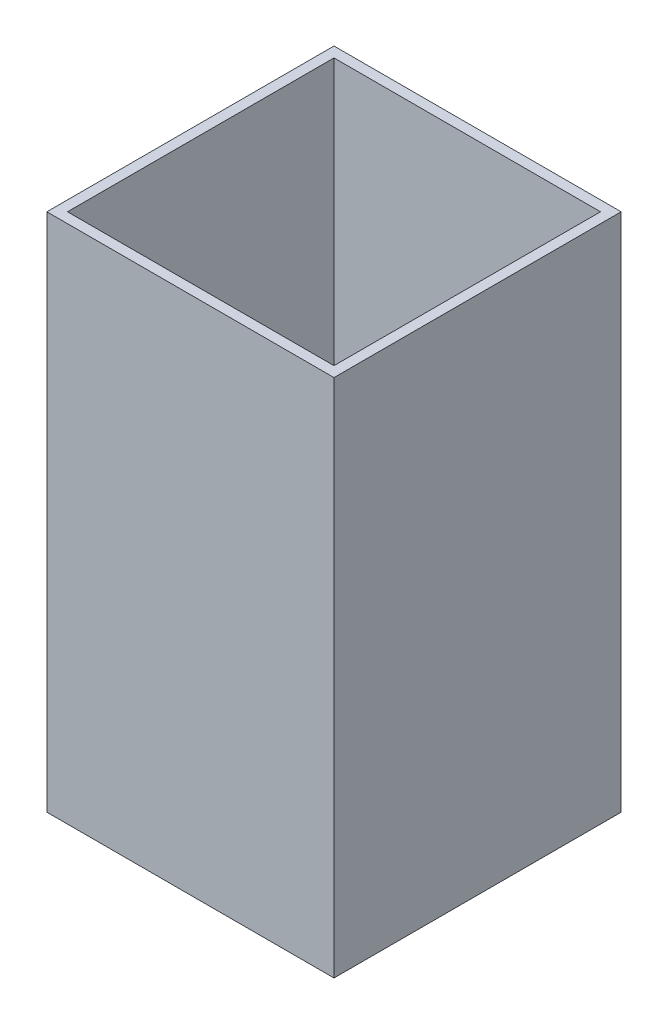
ISO-10303-21;
HEADER;
FILE_DESCRIPTION(('STEP AP214'),'2;1');
FILE_NAME('part.step','',(''),(''),'','','');
FILE_SCHEMA(('AUTOMOTIVE_DESIGN { 1 0 10303 214 1 1 1 1 }'));
ENDSEC;
DATA;
#1=APPLICATION_CONTEXT('core data for automotive mechanical design processes');
#2=APPLICATION_PROTOCOL_DEFINITION('international standard','automotive_design',2000,#1);
#3=PRODUCT_CONTEXT('',#1,'mechanical');
#4=PRODUCT('Part','Part','',(#3));
#5=PRODUCT_RELATED_PRODUCT_CATEGORY('part','',(#4));
#6=PRODUCT_DEFINITION_FORMATION('','',#4);
#7=PRODUCT_DEFINITION_CONTEXT('part definition',#1,'design');
#8=PRODUCT_DEFINITION('design','',#6,#7);
#9=PRODUCT_DEFINITION_SHAPE('','',#8);
#10=(LENGTH_UNIT() NAMED_UNIT(*) SI_UNIT(.MILLI.,.METRE.));
#11=(NAMED_UNIT(*) PLANE_ANGLE_UNIT() SI_UNIT($,.RADIAN.));
#12=(NAMED_UNIT(*) SI_UNIT($,.STERADIAN.) SOLID_ANGLE_UNIT());
#13=UNCERTAINTY_MEASURE_WITH_UNIT(LENGTH_MEASURE(1.E-05),#10,'distance_accuracy_value','');
#14=(GEOMETRIC_REPRESENTATION_CONTEXT(3) GLOBAL_UNCERTAINTY_ASSIGNED_CONTEXT((#13)) GLOBAL_UNIT_ASSIGNED_CONTEXT((#10,
#11,#12)) REPRESENTATION_CONTEXT('',''));
#15=CARTESIAN_POINT('',(0.,0.,0.));
#16=DIRECTION('',(0.,0.,1.));
#17=DIRECTION('',(1.,0.,0.));
#18=AXIS2_PLACEMENT_3D('',#15,#16,#17);
#19=CARTESIAN_POINT('',(3.175,160.,-3.17499999999999));
#20=DIRECTION('',(1.,0.,0.));
#21=DIRECTION('',(0.,0.,-1.));
#22=AXIS2_PLACEMENT_3D('',#19,#20,#21);
#23=PLANE('',#22);
#24=DIRECTION('',(0.,-1.,0.));
#25=VECTOR('',#24,1.);
#26=CARTESIAN_POINT('',(3.175,160.,-3.17499999999999));
#27=LINE('',#26,#25);
#28=CARTESIAN_POINT('',(3.175,160.,-3.17499999999999));
#29=VERTEX_POINT('',#28);
#30=CARTESIAN_POINT('',(3.175,3.17500000000001,-3.17499999999999));
#31=VERTEX_POINT('',#30);
#32=EDGE_CURVE('E105',#29,#31,#27,.T.);
#33=ORIENTED_EDGE('',*,*,#32,.T.);
#34=DIRECTION('',(0.,0.,-1.));
#35=VECTOR('',#34,1.);
#36=CARTESIAN_POINT('',(3.175,3.17500000000001,-3.17499999999999));
#37=LINE('',#36,#35);
#38=CARTESIAN_POINT('',(3.17499999999998,3.17500000000001,-85.175));
#39=VERTEX_POINT('',#38);
#40=EDGE_CURVE('E96',#31,#39,#37,.T.);
#41=ORIENTED_EDGE('',*,*,#40,.T.);
#42=DIRECTION('',(0.,-1.,0.));
#43=VECTOR('',#42,1.);
#44=CARTESIAN_POINT('',(3.17499999999998,160.,-85.175));
#45=LINE('',#44,#43);
#46=CARTESIAN_POINT('',(3.17499999999998,160.,-85.175));
#47=VERTEX_POINT('',#46);
#48=EDGE_CURVE('E102',#47,#39,#45,.T.);
#49=ORIENTED_EDGE('',*,*,#48,.F.);
#50=DIRECTION('',(0.,0.,1.));
#51=VECTOR('',#50,1.);
#52=CARTESIAN_POINT('',(3.175,160.,-3.17499999999999));
#53=LINE('',#52,#51);
#54=EDGE_CURVE('E106',#47,#29,#53,.T.);
#55=ORIENTED_EDGE('',*,*,#54,.T.);
#56=EDGE_LOOP('',(#33,#41,#49,#55));
#57=FACE_BOUND('',#56,.T.);
#58=ADVANCED_FACE('F33',(#57),#23,.T.);
#59=CARTESIAN_POINT('',(3.175,160.,-3.17499999999999));
#60=DIRECTION('',(0.,0.,-1.));
#61=DIRECTION('',(-1.,0.,0.));
#62=AXIS2_PLACEMENT_3D('',#59,#60,#61);
#63=PLANE('',#62);
#64=DIRECTION('',(0.,-1.,0.));
#65=VECTOR('',#64,1.);
#66=CARTESIAN_POINT('',(85.175,160.,-3.17499999999999));
#67=LINE('',#66,#65);
#68=CARTESIAN_POINT('',(85.175,160.,-3.17499999999999));
#69=VERTEX_POINT('',#68);
#70=CARTESIAN_POINT('',(85.175,3.17500000000001,-3.17499999999999));
#71=VERTEX_POINT('',#70);
#72=EDGE_CURVE('E113',#69,#71,#67,.T.);
#73=ORIENTED_EDGE('',*,*,#72,.T.);
#74=DIRECTION('',(-1.,0.,0.));
#75=VECTOR('',#74,1.);
#76=CARTESIAN_POINT('',(3.175,3.17500000000001,-3.17499999999999));
#77=LINE('',#76,#75);
#78=EDGE_CURVE('E107',#71,#31,#77,.T.);
#79=ORIENTED_EDGE('',*,*,#78,.T.);
#80=ORIENTED_EDGE('',*,*,#32,.F.);
#81=DIRECTION('',(1.,0.,0.));
#82=VECTOR('',#81,1.);
#83=CARTESIAN_POINT('',(3.175,160.,-3.17499999999999));
#84=LINE('',#83,#82);
#85=EDGE_CURVE('E175',#29,#69,#84,.T.);
#86=ORIENTED_EDGE('',*,*,#85,.T.);
#87=EDGE_LOOP('',(#73,#79,#80,#86));
#88=FACE_BOUND('',#87,.T.);
#89=ADVANCED_FACE('F183',(#88),#63,.T.);
#90=CARTESIAN_POINT('',(85.175,160.,-3.17499999999999));
#91=DIRECTION('',(-1.,0.,0.));
#92=DIRECTION('',(0.,0.,1.));
#93=AXIS2_PLACEMENT_3D('',#90,#91,#92);
#94=PLANE('',#93);
#95=DIRECTION('',(0.,-1.,0.));
#96=VECTOR('',#95,1.);
#97=CARTESIAN_POINT('',(85.175,160.,-85.175));
#98=LINE('',#97,#96);
#99=CARTESIAN_POINT('',(85.175,160.,-85.175));
#100=VERTEX_POINT('',#99);
#101=CARTESIAN_POINT('',(85.175,3.17500000000001,-85.175));
#102=VERTEX_POINT('',#101);
#103=EDGE_CURVE('E54',#100,#102,#98,.T.);
#104=ORIENTED_EDGE('',*,*,#103,.T.);
#105=DIRECTION('',(0.,0.,1.));
#106=VECTOR('',#105,1.);
#107=CARTESIAN_POINT('',(85.175,3.17500000000001,-3.17499999999999));
#108=LINE('',#107,#106);
#109=EDGE_CURVE('E48',#102,#71,#108,.T.);
#110=ORIENTED_EDGE('',*,*,#109,.T.);
#111=ORIENTED_EDGE('',*,*,#72,.F.);
#112=DIRECTION('',(0.,0.,-1.));
#113=VECTOR('',#112,1.);
#114=CARTESIAN_POINT('',(85.175,160.,-3.17499999999999));
#115=LINE('',#114,#113);
#116=EDGE_CURVE('E115',#69,#100,#115,.T.);
#117=ORIENTED_EDGE('',*,*,#116,.T.);
#118=EDGE_LOOP('',(#104,#110,#111,#117));
#119=FACE_BOUND('',#118,.T.);
#120=ADVANCED_FACE('F181',(#119),#94,.T.);
#121=CARTESIAN_POINT('',(3.17499999999998,160.,-85.175));
#122=DIRECTION('',(0.,0.,1.));
#123=DIRECTION('',(1.,0.,0.));
#124=AXIS2_PLACEMENT_3D('',#121,#122,#123);
#125=PLANE('',#124);
#126=ORIENTED_EDGE('',*,*,#48,.T.);
#127=DIRECTION('',(1.,0.,0.));
#128=VECTOR('',#127,1.);
#129=CARTESIAN_POINT('',(3.17499999999998,3.17500000000001,-85.175));
#130=LINE('',#129,#128);
#131=EDGE_CURVE('E11',#39,#102,#130,.T.);
#132=ORIENTED_EDGE('',*,*,#131,.T.);
#133=ORIENTED_EDGE('',*,*,#103,.F.);
#134=DIRECTION('',(-1.,0.,0.));
#135=VECTOR('',#134,1.);
#136=CARTESIAN_POINT('',(3.17499999999998,160.,-85.175));
#137=LINE('',#136,#135);
#138=EDGE_CURVE('E111',#100,#47,#137,.T.);
#139=ORIENTED_EDGE('',*,*,#138,.T.);
#140=EDGE_LOOP('',(#126,#132,#133,#139));
#141=FACE_BOUND('',#140,.T.);
#142=ADVANCED_FACE('F109',(#141),#125,.T.);
#143=CARTESIAN_POINT('',(0.,160.,0.));
#144=DIRECTION('',(0.,-1.,0.));
#145=DIRECTION('',(0.,0.,-1.));
#146=AXIS2_PLACEMENT_3D('',#143,#144,#145);
#147=PLANE('',#146);
#148=DIRECTION('',(0.,0.,1.));
#149=VECTOR('',#148,1.);
#150=CARTESIAN_POINT('',(0.,160.,0.));
#151=LINE('',#150,#149);
#152=CARTESIAN_POINT('',(0.,160.,-88.35));
#153=VERTEX_POINT('',#152);
#154=CARTESIAN_POINT('',(0.,160.,0.));
#155=VERTEX_POINT('',#154);
#156=EDGE_CURVE('E123',#153,#155,#151,.T.);
#157=ORIENTED_EDGE('',*,*,#156,.T.);
#158=DIRECTION('',(1.,0.,0.));
#159=VECTOR('',#158,1.);
#160=CARTESIAN_POINT('',(0.,160.,0.));
#161=LINE('',#160,#159);
#162=CARTESIAN_POINT('',(88.35,160.,0.));
#163=VERTEX_POINT('',#162);
#164=EDGE_CURVE('E126',#155,#163,#161,.T.);
#165=ORIENTED_EDGE('',*,*,#164,.T.);
#166=DIRECTION('',(0.,0.,-1.));
#167=VECTOR('',#166,1.);
#168=CARTESIAN_POINT('',(88.35,160.,0.));
#169=LINE('',#168,#167);
#170=CARTESIAN_POINT('',(88.35,160.,-88.35));
#171=VERTEX_POINT('',#170);
#172=EDGE_CURVE('E129',#163,#171,#169,.T.);
#173=ORIENTED_EDGE('',*,*,#172,.T.);
#174=DIRECTION('',(-1.,0.,0.));
#175=VECTOR('',#174,1.);
#176=CARTESIAN_POINT('',(0.,160.,-88.35));
#177=LINE('',#176,#175);
#178=EDGE_CURVE('E131',#171,#153,#177,.T.);
#179=ORIENTED_EDGE('',*,*,#178,.T.);
#180=EDGE_LOOP('',(#157,#165,#173,#179));
#181=FACE_BOUND('',#180,.T.);
#182=ORIENTED_EDGE('',*,*,#54,.F.);
#183=ORIENTED_EDGE('',*,*,#138,.F.);
#184=ORIENTED_EDGE('',*,*,#116,.F.);
#185=ORIENTED_EDGE('',*,*,#85,.F.);
#186=EDGE_LOOP('',(#182,#183,#184,#185));
#187=FACE_BOUND('',#186,.T.);
#188=ADVANCED_FACE('F169',(#181,#187),#147,.F.);
#189=CARTESIAN_POINT('',(0.,0.,0.));
#190=DIRECTION('',(0.,-1.,0.));
#191=DIRECTION('',(0.,0.,-1.));
#192=AXIS2_PLACEMENT_3D('',#189,#190,#191);
#193=PLANE('',#192);
#194=DIRECTION('',(0.,0.,1.));
#195=VECTOR('',#194,1.);
#196=CARTESIAN_POINT('',(0.,0.,0.));
#197=LINE('',#196,#195);
#198=CARTESIAN_POINT('',(0.,0.,-88.35));
#199=VERTEX_POINT('',#198);
#200=CARTESIAN_POINT('',(0.,0.,0.));
#201=VERTEX_POINT('',#200);
#202=EDGE_CURVE('E122',#199,#201,#197,.T.);
#203=ORIENTED_EDGE('',*,*,#202,.F.);
#204=DIRECTION('',(-1.,0.,0.));
#205=VECTOR('',#204,1.);
#206=CARTESIAN_POINT('',(0.,0.,-88.35));
#207=LINE('',#206,#205);
#208=CARTESIAN_POINT('',(88.35,0.,-88.35));
#209=VERTEX_POINT('',#208);
#210=EDGE_CURVE('E127',#209,#199,#207,.T.);
#211=ORIENTED_EDGE('',*,*,#210,.F.);
#212=DIRECTION('',(0.,0.,-1.));
#213=VECTOR('',#212,1.);
#214=CARTESIAN_POINT('',(88.35,0.,0.));
#215=LINE('',#214,#213);
#216=CARTESIAN_POINT('',(88.35,0.,0.));
#217=VERTEX_POINT('',#216);
#218=EDGE_CURVE('E139',#217,#209,#215,.T.);
#219=ORIENTED_EDGE('',*,*,#218,.F.);
#220=DIRECTION('',(1.,0.,0.));
#221=VECTOR('',#220,1.);
#222=CARTESIAN_POINT('',(0.,0.,0.));
#223=LINE('',#222,#221);
#224=EDGE_CURVE('E136',#201,#217,#223,.T.);
#225=ORIENTED_EDGE('',*,*,#224,.F.);
#226=EDGE_LOOP('',(#203,#211,#219,#225));
#227=FACE_BOUND('',#226,.T.);
#228=ADVANCED_FACE('F158',(#227),#193,.T.);
#229=CARTESIAN_POINT('',(0.,160.,0.));
#230=DIRECTION('',(1.,0.,0.));
#231=DIRECTION('',(0.,0.,-1.));
#232=AXIS2_PLACEMENT_3D('',#229,#230,#231);
#233=PLANE('',#232);
#234=ORIENTED_EDGE('',*,*,#202,.T.);
#235=DIRECTION('',(0.,-1.,0.));
#236=VECTOR('',#235,1.);
#237=CARTESIAN_POINT('',(0.,160.,0.));
#238=LINE('',#237,#236);
#239=EDGE_CURVE('E41',#155,#201,#238,.T.);
#240=ORIENTED_EDGE('',*,*,#239,.F.);
#241=ORIENTED_EDGE('',*,*,#156,.F.);
#242=DIRECTION('',(0.,-1.,0.));
#243=VECTOR('',#242,1.);
#244=CARTESIAN_POINT('',(0.,160.,-88.35));
#245=LINE('',#244,#243);
#246=EDGE_CURVE('E133',#153,#199,#245,.T.);
#247=ORIENTED_EDGE('',*,*,#246,.T.);
#248=EDGE_LOOP('',(#234,#240,#241,#247));
#249=FACE_BOUND('',#248,.T.);
#250=ADVANCED_FACE('F35',(#249),#233,.F.);
#251=CARTESIAN_POINT('',(0.,160.,0.));
#252=DIRECTION('',(0.,0.,-1.));
#253=DIRECTION('',(-1.,0.,0.));
#254=AXIS2_PLACEMENT_3D('',#251,#252,#253);
#255=PLANE('',#254);
#256=ORIENTED_EDGE('',*,*,#224,.T.);
#257=DIRECTION('',(0.,-1.,0.));
#258=VECTOR('',#257,1.);
#259=CARTESIAN_POINT('',(88.35,160.,0.));
#260=LINE('',#259,#258);
#261=EDGE_CURVE('E147',#163,#217,#260,.T.);
#262=ORIENTED_EDGE('',*,*,#261,.F.);
#263=ORIENTED_EDGE('',*,*,#164,.F.);
#264=ORIENTED_EDGE('',*,*,#239,.T.);
#265=EDGE_LOOP('',(#256,#262,#263,#264));
#266=FACE_BOUND('',#265,.T.);
#267=ADVANCED_FACE('F151',(#266),#255,.F.);
#268=CARTESIAN_POINT('',(88.35,160.,0.));
#269=DIRECTION('',(-1.,0.,0.));
#270=DIRECTION('',(0.,0.,1.));
#271=AXIS2_PLACEMENT_3D('',#268,#269,#270);
#272=PLANE('',#271);
#273=ORIENTED_EDGE('',*,*,#218,.T.);
#274=DIRECTION('',(0.,-1.,0.));
#275=VECTOR('',#274,1.);
#276=CARTESIAN_POINT('',(88.35,160.,-88.35));
#277=LINE('',#276,#275);
#278=EDGE_CURVE('E145',#171,#209,#277,.T.);
#279=ORIENTED_EDGE('',*,*,#278,.F.);
#280=ORIENTED_EDGE('',*,*,#172,.F.);
#281=ORIENTED_EDGE('',*,*,#261,.T.);
#282=EDGE_LOOP('',(#273,#279,#280,#281));
#283=FACE_BOUND('',#282,.T.);
#284=ADVANCED_FACE('F167',(#283),#272,.F.);
#285=CARTESIAN_POINT('',(0.,160.,-88.35));
#286=DIRECTION('',(0.,0.,1.));
#287=DIRECTION('',(1.,0.,0.));
#288=AXIS2_PLACEMENT_3D('',#285,#286,#287);
#289=PLANE('',#288);
#290=ORIENTED_EDGE('',*,*,#210,.T.);
#291=ORIENTED_EDGE('',*,*,#246,.F.);
#292=ORIENTED_EDGE('',*,*,#178,.F.);
#293=ORIENTED_EDGE('',*,*,#278,.T.);
#294=EDGE_LOOP('',(#290,#291,#292,#293));
#295=FACE_BOUND('',#294,.T.);
#296=ADVANCED_FACE('F163',(#295),#289,.F.);
#297=CARTESIAN_POINT('',(0.,3.175,0.));
#298=DIRECTION('',(0.,-1.,0.));
#299=DIRECTION('',(0.,0.,-1.));
#300=AXIS2_PLACEMENT_3D('',#297,#298,#299);
#301=PLANE('',#300);
#302=ORIENTED_EDGE('',*,*,#40,.F.);
#303=ORIENTED_EDGE('',*,*,#78,.F.);
#304=ORIENTED_EDGE('',*,*,#109,.F.);
#305=ORIENTED_EDGE('',*,*,#131,.F.);
#306=EDGE_LOOP('',(#302,#303,#304,#305));
#307=FACE_BOUND('',#306,.T.);
#308=ADVANCED_FACE('F95',(#307),#301,.F.);
#309=CLOSED_SHELL('',(#58,#89,#120,#142,#188,#228,#250,#267,#284,#296,#308));
#310=MANIFOLD_SOLID_BREP('B2',#309);
#311=ADVANCED_BREP_SHAPE_REPRESENTATION('',(#18,#310),#14);
#312=SHAPE_DEFINITION_REPRESENTATION(#9,#311);
ENDSEC;
END-ISO-10303-21;
